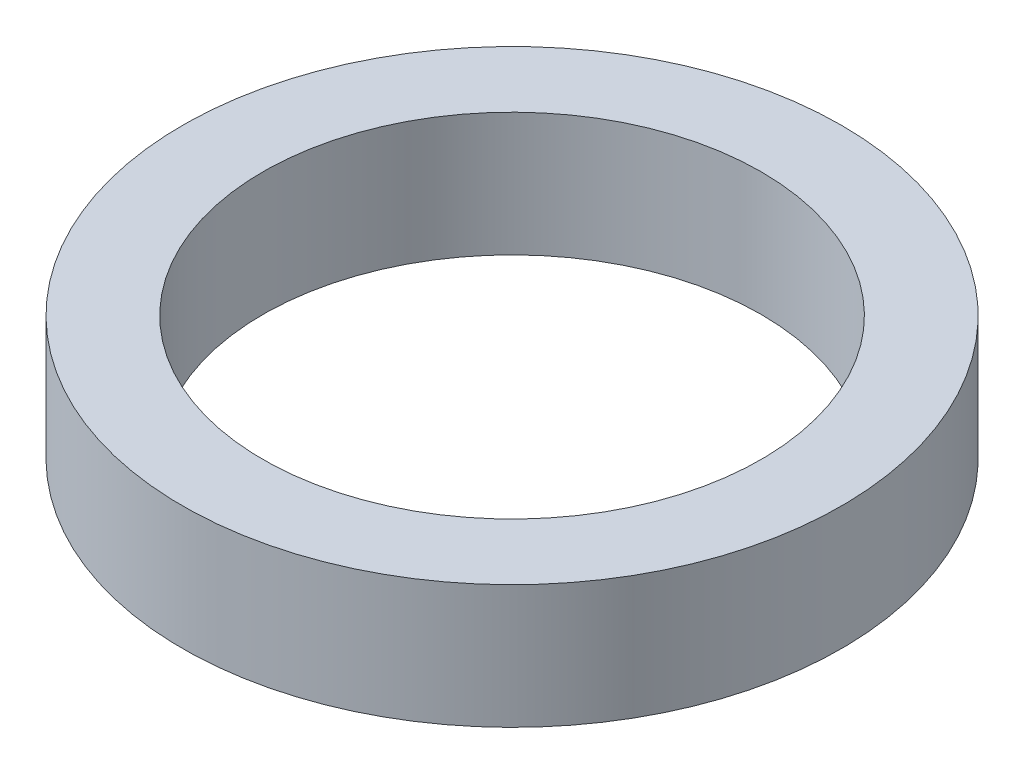
ISO-10303-21;
HEADER;
FILE_DESCRIPTION(('STEP AP214'),'2;1');
FILE_NAME('part.step','',(''),(''),'','','');
FILE_SCHEMA(('AUTOMOTIVE_DESIGN { 1 0 10303 214 1 1 1 1 }'));
ENDSEC;
DATA;
#1=APPLICATION_CONTEXT('core data for automotive mechanical design processes');
#2=APPLICATION_PROTOCOL_DEFINITION('international standard','automotive_design',2000,#1);
#3=PRODUCT_CONTEXT('',#1,'mechanical');
#4=PRODUCT('Part','Part','',(#3));
#5=PRODUCT_RELATED_PRODUCT_CATEGORY('part','',(#4));
#6=PRODUCT_DEFINITION_FORMATION('','',#4);
#7=PRODUCT_DEFINITION_CONTEXT('part definition',#1,'design');
#8=PRODUCT_DEFINITION('design','',#6,#7);
#9=PRODUCT_DEFINITION_SHAPE('','',#8);
#10=(LENGTH_UNIT() NAMED_UNIT(*) SI_UNIT(.MILLI.,.METRE.));
#11=(NAMED_UNIT(*) PLANE_ANGLE_UNIT() SI_UNIT($,.RADIAN.));
#12=(NAMED_UNIT(*) SI_UNIT($,.STERADIAN.) SOLID_ANGLE_UNIT());
#13=UNCERTAINTY_MEASURE_WITH_UNIT(LENGTH_MEASURE(1.E-05),#10,'distance_accuracy_value','');
#14=(GEOMETRIC_REPRESENTATION_CONTEXT(3) GLOBAL_UNCERTAINTY_ASSIGNED_CONTEXT((#13)) GLOBAL_UNIT_ASSIGNED_CONTEXT((#10,
#11,#12)) REPRESENTATION_CONTEXT('',''));
#15=CARTESIAN_POINT('',(0.,0.,0.));
#16=DIRECTION('',(0.,0.,1.));
#17=DIRECTION('',(1.,0.,0.));
#18=AXIS2_PLACEMENT_3D('',#15,#16,#17);
#19=CARTESIAN_POINT('',(0.,-1.190625,0.));
#20=DIRECTION('',(0.,1.,0.));
#21=DIRECTION('',(0.,0.,1.));
#22=AXIS2_PLACEMENT_3D('',#19,#20,#21);
#23=PLANE('',#22);
#24=CARTESIAN_POINT('',(0.,-1.190625,0.));
#25=DIRECTION('',(0.,-1.,0.));
#26=DIRECTION('',(0.,0.,-1.));
#27=AXIS2_PLACEMENT_3D('',#24,#25,#26);
#28=CIRCLE('',#27,4.8006);
#29=CARTESIAN_POINT('',(0.,-1.190625,-4.8006));
#30=VERTEX_POINT('',#29);
#31=EDGE_CURVE('E26',#30,#30,#28,.F.);
#32=ORIENTED_EDGE('',*,*,#31,.T.);
#33=EDGE_LOOP('',(#32));
#34=FACE_BOUND('',#33,.T.);
#35=CARTESIAN_POINT('',(0.,-1.190625,0.));
#36=DIRECTION('',(0.,-1.,0.));
#37=DIRECTION('',(0.,0.,-1.));
#38=AXIS2_PLACEMENT_3D('',#35,#36,#37);
#39=CIRCLE('',#38,6.35);
#40=CARTESIAN_POINT('',(0.,-1.190625,-6.35));
#41=VERTEX_POINT('',#40);
#42=EDGE_CURVE('E17',#41,#41,#39,.F.);
#43=ORIENTED_EDGE('',*,*,#42,.F.);
#44=EDGE_LOOP('',(#43));
#45=FACE_BOUND('',#44,.T.);
#46=ADVANCED_FACE('F14',(#34,#45),#23,.F.);
#47=CARTESIAN_POINT('',(0.,1.190625,0.));
#48=DIRECTION('',(0.,-1.,0.));
#49=DIRECTION('',(0.,0.,-1.));
#50=AXIS2_PLACEMENT_3D('',#47,#48,#49);
#51=CYLINDRICAL_SURFACE('',#50,6.35);
#52=ORIENTED_EDGE('',*,*,#42,.T.);
#53=EDGE_LOOP('',(#52));
#54=FACE_BOUND('',#53,.T.);
#55=CARTESIAN_POINT('',(0.,1.190625,0.));
#56=DIRECTION('',(0.,-1.,0.));
#57=DIRECTION('',(0.,0.,-1.));
#58=AXIS2_PLACEMENT_3D('',#55,#56,#57);
#59=CIRCLE('',#58,6.35);
#60=CARTESIAN_POINT('',(0.,1.190625,-6.35));
#61=VERTEX_POINT('',#60);
#62=EDGE_CURVE('E21',#61,#61,#59,.F.);
#63=ORIENTED_EDGE('',*,*,#62,.F.);
#64=EDGE_LOOP('',(#63));
#65=FACE_BOUND('',#64,.T.);
#66=ADVANCED_FACE('F34',(#54,#65),#51,.T.);
#67=CARTESIAN_POINT('',(0.,1.190625,0.));
#68=DIRECTION('',(0.,-1.,0.));
#69=DIRECTION('',(0.,0.,-1.));
#70=AXIS2_PLACEMENT_3D('',#67,#68,#69);
#71=CYLINDRICAL_SURFACE('',#70,4.8006);
#72=CARTESIAN_POINT('',(0.,1.190625,0.));
#73=DIRECTION('',(0.,-1.,0.));
#74=DIRECTION('',(0.,0.,-1.));
#75=AXIS2_PLACEMENT_3D('',#72,#73,#74);
#76=CIRCLE('',#75,4.8006);
#77=CARTESIAN_POINT('',(0.,1.190625,-4.8006));
#78=VERTEX_POINT('',#77);
#79=EDGE_CURVE('E10',#78,#78,#76,.T.);
#80=ORIENTED_EDGE('',*,*,#79,.F.);
#81=EDGE_LOOP('',(#80));
#82=FACE_BOUND('',#81,.T.);
#83=ORIENTED_EDGE('',*,*,#31,.F.);
#84=EDGE_LOOP('',(#83));
#85=FACE_BOUND('',#84,.T.);
#86=ADVANCED_FACE('F42',(#82,#85),#71,.F.);
#87=CARTESIAN_POINT('',(0.,1.190625,0.));
#88=DIRECTION('',(0.,1.,0.));
#89=DIRECTION('',(0.,0.,1.));
#90=AXIS2_PLACEMENT_3D('',#87,#88,#89);
#91=PLANE('',#90);
#92=ORIENTED_EDGE('',*,*,#79,.T.);
#93=EDGE_LOOP('',(#92));
#94=FACE_BOUND('',#93,.T.);
#95=ORIENTED_EDGE('',*,*,#62,.T.);
#96=EDGE_LOOP('',(#95));
#97=FACE_BOUND('',#96,.T.);
#98=ADVANCED_FACE('F43',(#94,#97),#91,.T.);
#99=CLOSED_SHELL('',(#46,#66,#86,#98));
#100=MANIFOLD_SOLID_BREP('B1',#99);
#101=ADVANCED_BREP_SHAPE_REPRESENTATION('',(#18,#100),#14);
#102=SHAPE_DEFINITION_REPRESENTATION(#9,#101);
ENDSEC;
END-ISO-10303-21;
